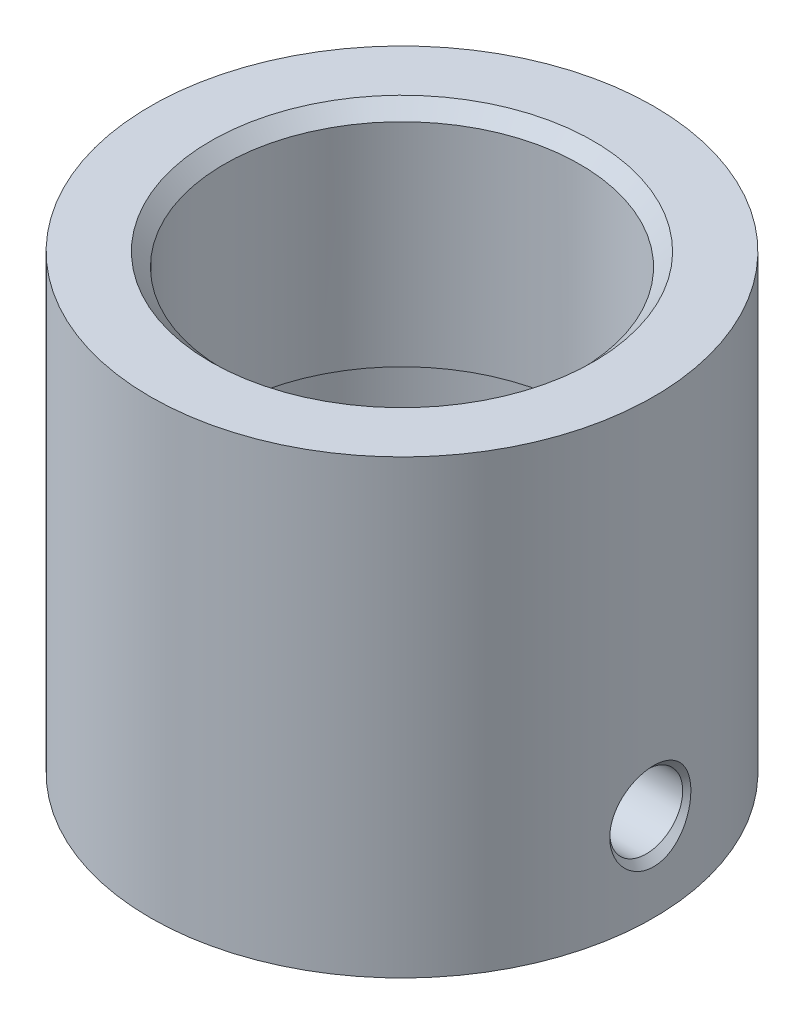
ISO-10303-21;
HEADER;
FILE_DESCRIPTION(('STEP AP214'),'2;1');
FILE_NAME('part.step','',(''),(''),'','','');
FILE_SCHEMA(('AUTOMOTIVE_DESIGN { 1 0 10303 214 1 1 1 1 }'));
ENDSEC;
DATA;
#1=APPLICATION_CONTEXT('core data for automotive mechanical design processes');
#2=APPLICATION_PROTOCOL_DEFINITION('international standard','automotive_design',2000,#1);
#3=PRODUCT_CONTEXT('',#1,'mechanical');
#4=PRODUCT('Part','Part','',(#3));
#5=PRODUCT_RELATED_PRODUCT_CATEGORY('part','',(#4));
#6=PRODUCT_DEFINITION_FORMATION('','',#4);
#7=PRODUCT_DEFINITION_CONTEXT('part definition',#1,'design');
#8=PRODUCT_DEFINITION('design','',#6,#7);
#9=PRODUCT_DEFINITION_SHAPE('','',#8);
#10=(LENGTH_UNIT() NAMED_UNIT(*) SI_UNIT(.MILLI.,.METRE.));
#11=(NAMED_UNIT(*) PLANE_ANGLE_UNIT() SI_UNIT($,.RADIAN.));
#12=(NAMED_UNIT(*) SI_UNIT($,.STERADIAN.) SOLID_ANGLE_UNIT());
#13=UNCERTAINTY_MEASURE_WITH_UNIT(LENGTH_MEASURE(1.E-05),#10,'distance_accuracy_value','');
#14=(GEOMETRIC_REPRESENTATION_CONTEXT(3) GLOBAL_UNCERTAINTY_ASSIGNED_CONTEXT((#13)) GLOBAL_UNIT_ASSIGNED_CONTEXT((#10,
#11,#12)) REPRESENTATION_CONTEXT('',''));
#15=CARTESIAN_POINT('',(0.,0.,0.));
#16=DIRECTION('',(0.,0.,1.));
#17=DIRECTION('',(1.,0.,0.));
#18=AXIS2_PLACEMENT_3D('',#15,#16,#17);
#19=CARTESIAN_POINT('',(0.,26.,0.));
#20=DIRECTION('',(0.,-1.,0.));
#21=DIRECTION('',(0.,0.,-1.));
#22=AXIS2_PLACEMENT_3D('',#19,#20,#21);
#23=CYLINDRICAL_SURFACE('',#22,14.5);
#24=CARTESIAN_POINT('',(14.3998207057451,3.35313342061165,-1.70151808104775));
#25=CARTESIAN_POINT('',(14.4090736667693,3.26254983339858,-1.62320654346101));
#26=CARTESIAN_POINT('',(14.4184592553395,3.17767824931504,-1.53830086542701));
#27=CARTESIAN_POINT('',(14.436684755225,3.02156744104962,-1.35663680703584));
#28=CARTESIAN_POINT('',(14.4455245045379,2.95033225103381,-1.25987493300558));
#29=CARTESIAN_POINT('',(14.4628495980231,2.8158281735512,-1.04361368095848));
#30=CARTESIAN_POINT('',(14.4711540215218,2.75465303008965,-0.922783200290199));
#31=CARTESIAN_POINT('',(14.4849695415903,2.65517980582286,-0.671866678579916));
#32=CARTESIAN_POINT('',(14.4904811598407,2.61687745226895,-0.541782371282166));
#33=CARTESIAN_POINT('',(14.4976882435676,2.56703193052261,-0.286547503062587));
#34=CARTESIAN_POINT('',(14.4996372420317,2.55370905265772,-0.161750512870036));
#35=CARTESIAN_POINT('',(14.500269596164,2.54895642325261,0.088242777111606));
#36=CARTESIAN_POINT('',(14.4989540646005,2.55751921165595,0.213438926312048));
#37=CARTESIAN_POINT('',(14.4933340720818,2.59531931466773,0.455329964313461));
#38=CARTESIAN_POINT('',(14.4891535885481,2.6236999645229,0.572163386728937));
#39=CARTESIAN_POINT('',(14.4783868198641,2.69901516354803,0.799551850744931));
#40=CARTESIAN_POINT('',(14.4718003152172,2.74595140554085,0.910106318464994));
#41=CARTESIAN_POINT('',(14.4566935084134,2.85809502087953,1.12514649130659));
#42=CARTESIAN_POINT('',(14.4481261698863,2.9237577639068,1.22939059422197));
#43=CARTESIAN_POINT('',(14.430022478645,3.0705115127926,1.42626952105182));
#44=CARTESIAN_POINT('',(14.420485849993,3.15160691778844,1.51890102223211));
#45=CARTESIAN_POINT('',(14.4006428715651,3.33316066613405,1.69708718715478));
#46=CARTESIAN_POINT('',(14.3903307095226,3.4345948883259,1.78164639225084));
#47=CARTESIAN_POINT('',(14.3706541116705,3.64945255366651,1.93396286160925));
#48=CARTESIAN_POINT('',(14.3612899963026,3.76288002425182,2.0017144560099));
#49=CARTESIAN_POINT('',(14.3437723951487,4.00766719109626,2.1237450065666));
#50=CARTESIAN_POINT('',(14.3357627863256,4.13973391467967,2.17662873792498));
#51=CARTESIAN_POINT('',(14.322733071464,4.41072373837199,2.26078212649499));
#52=CARTESIAN_POINT('',(14.3177136926852,4.54964849754752,2.29204652592484));
#53=CARTESIAN_POINT('',(14.3110414082137,4.83730593086805,2.33335980380727));
#54=CARTESIAN_POINT('',(14.309555564596,4.98619455158544,2.34235664886581));
#55=CARTESIAN_POINT('',(14.3106078927464,5.28343948987046,2.33591693159675));
#56=CARTESIAN_POINT('',(14.3131465974459,5.43179573433331,2.32047713336471));
#57=CARTESIAN_POINT('',(14.3220192273299,5.72581720507537,2.26507389634563));
#58=CARTESIAN_POINT('',(14.3284034477543,5.87141992031878,2.22478529147919));
#59=CARTESIAN_POINT('',(14.3442568796177,6.1535705463764,2.12016002004971));
#60=CARTESIAN_POINT('',(14.3537262256371,6.29011806186889,2.05582230439036));
#61=CARTESIAN_POINT('',(14.3744354804173,6.54775537183557,1.90558238032398));
#62=CARTESIAN_POINT('',(14.385644886208,6.66905619311687,1.82003882337264));
#63=CARTESIAN_POINT('',(14.4085591739448,6.89446919326739,1.6287018984757));
#64=CARTESIAN_POINT('',(14.4202639201254,6.99858604416773,1.52291405155778));
#65=CARTESIAN_POINT('',(14.4420230386453,7.18034140462346,1.2999271944139));
#66=CARTESIAN_POINT('',(14.4521324334146,7.25910745516533,1.18365483802184));
#67=CARTESIAN_POINT('',(14.4701166872056,7.39401526485013,0.938491693490502));
#68=CARTESIAN_POINT('',(14.4779930201835,7.45017195787284,0.809609304671009));
#69=CARTESIAN_POINT('',(14.4899122693188,7.53343841039343,0.554422898235619));
#70=CARTESIAN_POINT('',(14.4942186791082,7.56256892304655,0.428789623826561));
#71=CARTESIAN_POINT('',(14.4995098582716,7.59803385524168,0.174290413594696));
#72=CARTESIAN_POINT('',(14.5004960622795,7.60437812061523,0.0454258982202043));
#73=CARTESIAN_POINT('',(14.4990739575387,7.59429295655022,-0.203526197326038));
#74=CARTESIAN_POINT('',(14.4968676782199,7.57921993599244,-0.323672540549693));
#75=CARTESIAN_POINT('',(14.4896748378335,7.5293794516358,-0.559703351680214));
#76=CARTESIAN_POINT('',(14.4846883297811,7.49461236337576,-0.675587900808769));
#77=CARTESIAN_POINT('',(14.4724494192999,7.40662361457527,-0.900538292064099));
#78=CARTESIAN_POINT('',(14.4651873300495,7.35332295084456,-1.00957254558632));
#79=CARTESIAN_POINT('',(14.4491501390911,7.2302660135206,-1.21777761396307));
#80=CARTESIAN_POINT('',(14.4403746874816,7.16050593300464,-1.3169461394038));
#81=CARTESIAN_POINT('',(14.421589411466,7.00202787811996,-1.50919309343842));
#82=CARTESIAN_POINT('',(14.4115368778965,6.91240876404083,-1.6015235216947));
#83=CARTESIAN_POINT('',(14.3916774555139,6.71990102644793,-1.77113775355985));
#84=CARTESIAN_POINT('',(14.3818706518551,6.61700787691817,-1.84841640233878));
#85=CARTESIAN_POINT('',(14.3627006708727,6.39215857925481,-1.99211120124944));
#86=CARTESIAN_POINT('',(14.3534334424584,6.26933903797698,-2.05719041284637));
#87=CARTESIAN_POINT('',(14.3372322319333,6.01485556161351,-2.16722708203806));
#88=CARTESIAN_POINT('',(14.3302988730952,5.88318927519926,-2.21217916562803));
#89=CARTESIAN_POINT('',(14.3191589142442,5.60657438691383,-2.28321566857917));
#90=CARTESIAN_POINT('',(14.3151334019229,5.46129811882523,-2.30805719179887));
#91=CARTESIAN_POINT('',(14.3109383154676,5.16856388028875,-2.33392708654996));
#92=CARTESIAN_POINT('',(14.3107697365574,5.02110535656425,-2.33494931187043));
#93=CARTESIAN_POINT('',(14.3143516505899,4.72449134401652,-2.31289166994378));
#94=CARTESIAN_POINT('',(14.318195908769,4.57537953176971,-2.28923515955929));
#95=CARTESIAN_POINT('',(14.329501449434,4.28335477666343,-2.2173640140618));
#96=CARTESIAN_POINT('',(14.3369614898404,4.14043972347109,-2.16915781187427));
#97=CARTESIAN_POINT('',(14.3533246470289,3.88502011947513,-2.0578467929428));
#98=CARTESIAN_POINT('',(14.3618634624169,3.77110538141007,-1.99790145844625));
#99=CARTESIAN_POINT('',(14.3801582395916,3.55365967501007,-1.86165661104716));
#100=CARTESIAN_POINT('',(14.3899134489491,3.45012235828005,-1.7853671873969));
#101=CARTESIAN_POINT('',(14.3998207057451,3.35313342061165,-1.70151808104775));
#102=B_SPLINE_CURVE_WITH_KNOTS('',3,(#24,#25,#26,#27,#28,#29,#30,#31,#32,#33,#34,#35,#36,#37,
#38,#39,#40,#41,#42,#43,#44,#45,#46,#47,#48,#49,#50,#51,#52,#53,#54,#55,#56,#57,#58,#59,#60,#61,
#62,#63,#64,#65,#66,#67,#68,#69,#70,#71,#72,#73,#74,#75,#76,#77,#78,#79,#80,#81,#82,#83,#84,#85,
#86,#87,#88,#89,#90,#91,#92,#93,#94,#95,#96,#97,#98,#99,#100,#101),.UNSPECIFIED.,.T.,.F.,(4,2,2,
2,2,2,2,2,2,2,2,2,2,2,2,2,2,2,2,2,2,2,2,2,2,2,2,2,2,2,2,2,2,2,2,2,2,2,4),(0.,0.359952818555661,
0.720011960885404,1.124867306396,1.52964699927667,1.90429486746711,2.27881504836485,
2.6380742544735,2.99736624329188,3.36627391481056,3.735286902769,4.13097216698077,
4.52679073028781,4.95235718997434,5.37802711027645,5.82345380205119,6.26893948223879,
6.72038213696941,7.17184448731842,7.61613794090942,8.06031039891669,8.48045917134721,
8.90032997100636,9.28542125631568,9.67034612543834,10.0319511702033,10.3935493198889,
10.7567081449672,11.1199510480667,11.5055011815147,11.8911831242436,12.3072754896963,
12.7234788869304,13.1637763212161,13.6041873663628,14.055124585974,14.5059070110733,
14.8915502047763,15.276956022282),.UNSPECIFIED.);
#103=CARTESIAN_POINT('',(14.3998207057451,3.35313342061165,-1.70151808104775));
#104=VERTEX_POINT('',#103);
#105=EDGE_CURVE('E10',#104,#104,#102,.T.);
#106=ORIENTED_EDGE('',*,*,#105,.T.);
#107=EDGE_LOOP('',(#106));
#108=FACE_BOUND('',#107,.T.);
#109=CARTESIAN_POINT('',(0.,26.,0.));
#110=DIRECTION('',(0.,1.,0.));
#111=DIRECTION('',(0.,0.,1.));
#112=AXIS2_PLACEMENT_3D('',#109,#110,#111);
#113=CIRCLE('',#112,14.5);
#114=CARTESIAN_POINT('',(0.,26.,14.5));
#115=VERTEX_POINT('',#114);
#116=EDGE_CURVE('E45',#115,#115,#113,.T.);
#117=ORIENTED_EDGE('',*,*,#116,.F.);
#118=EDGE_LOOP('',(#117));
#119=FACE_BOUND('',#118,.T.);
#120=CARTESIAN_POINT('',(0.,0.,0.));
#121=DIRECTION('',(0.,1.,0.));
#122=DIRECTION('',(0.,0.,1.));
#123=AXIS2_PLACEMENT_3D('',#120,#121,#122);
#124=CIRCLE('',#123,14.5);
#125=CARTESIAN_POINT('',(0.,0.,14.5));
#126=VERTEX_POINT('',#125);
#127=EDGE_CURVE('E49',#126,#126,#124,.T.);
#128=ORIENTED_EDGE('',*,*,#127,.T.);
#129=EDGE_LOOP('',(#128));
#130=FACE_BOUND('',#129,.T.);
#131=ADVANCED_FACE('F34',(#108,#119,#130),#23,.T.);
#132=CARTESIAN_POINT('',(0.,26.,0.));
#133=DIRECTION('',(0.,1.,0.));
#134=DIRECTION('',(0.,0.,1.));
#135=AXIS2_PLACEMENT_3D('',#132,#133,#134);
#136=PLANE('',#135);
#137=CARTESIAN_POINT('',(0.,26.,0.));
#138=DIRECTION('',(0.,1.,0.));
#139=DIRECTION('',(0.,0.,1.));
#140=AXIS2_PLACEMENT_3D('',#137,#138,#139);
#141=CIRCLE('',#140,11.025);
#142=CARTESIAN_POINT('',(0.,26.,11.025));
#143=VERTEX_POINT('',#142);
#144=EDGE_CURVE('E67',#143,#143,#141,.T.);
#145=ORIENTED_EDGE('',*,*,#144,.F.);
#146=EDGE_LOOP('',(#145));
#147=FACE_BOUND('',#146,.T.);
#148=ORIENTED_EDGE('',*,*,#116,.T.);
#149=EDGE_LOOP('',(#148));
#150=FACE_BOUND('',#149,.T.);
#151=ADVANCED_FACE('F98',(#147,#150),#136,.T.);
#152=CARTESIAN_POINT('',(0.,0.,0.));
#153=DIRECTION('',(0.,1.,0.));
#154=DIRECTION('',(0.,0.,1.));
#155=AXIS2_PLACEMENT_3D('',#152,#153,#154);
#156=PLANE('',#155);
#157=CARTESIAN_POINT('',(0.,0.,0.));
#158=DIRECTION('',(0.,-1.,0.));
#159=DIRECTION('',(0.,0.,-1.));
#160=AXIS2_PLACEMENT_3D('',#157,#158,#159);
#161=CIRCLE('',#160,10.5);
#162=CARTESIAN_POINT('',(0.,0.,-10.5));
#163=VERTEX_POINT('',#162);
#164=EDGE_CURVE('E56',#163,#163,#161,.T.);
#165=ORIENTED_EDGE('',*,*,#164,.F.);
#166=EDGE_LOOP('',(#165));
#167=FACE_BOUND('',#166,.T.);
#168=ORIENTED_EDGE('',*,*,#127,.F.);
#169=EDGE_LOOP('',(#168));
#170=FACE_BOUND('',#169,.T.);
#171=ADVANCED_FACE('F102',(#167,#170),#156,.F.);
#172=CARTESIAN_POINT('',(0.,13.,0.));
#173=DIRECTION('',(0.,-1.,0.));
#174=DIRECTION('',(0.,0.,-1.));
#175=AXIS2_PLACEMENT_3D('',#172,#173,#174);
#176=CYLINDRICAL_SURFACE('',#175,10.5);
#177=CARTESIAN_POINT('',(10.2884616297896,5.07594316398738,-2.09703535791539));
#178=CARTESIAN_POINT('',(10.2884639484167,5.19262835251881,-2.09703104358514));
#179=CARTESIAN_POINT('',(10.2904655716909,5.3093678729874,-2.08727644066124));
#180=CARTESIAN_POINT('',(10.298243795859,5.53954442478796,-2.04854833259153));
#181=CARTESIAN_POINT('',(10.3040234172835,5.65297873772294,-2.01955944925293));
#182=CARTESIAN_POINT('',(10.3186767584052,5.87318150103123,-1.94329778822472));
#183=CARTESIAN_POINT('',(10.3275473997462,5.97995645920582,-1.8960431963126));
#184=CARTESIAN_POINT('',(10.3473784820406,6.18406033785099,-1.78464149353863));
#185=CARTESIAN_POINT('',(10.3583388063471,6.28138978511698,-1.72049532549625));
#186=CARTESIAN_POINT('',(10.3812859131232,6.46522127208049,-1.57616464686192));
#187=CARTESIAN_POINT('',(10.3932839529556,6.55157029854372,-1.49578700470832));
#188=CARTESIAN_POINT('',(10.4168532105564,6.70965398450324,-1.32169258527588));
#189=CARTESIAN_POINT('',(10.4284243983588,6.78138761956349,-1.22797487373363));
#190=CARTESIAN_POINT('',(10.449955631969,6.90879800100715,-1.02884762480045));
#191=CARTESIAN_POINT('',(10.4599007556973,6.96432934300232,-0.923343299298098));
#192=CARTESIAN_POINT('',(10.4769298523128,7.05682053178847,-0.704269706789683));
#193=CARTESIAN_POINT('',(10.4840140930083,7.09378211697946,-0.590701195845444));
#194=CARTESIAN_POINT('',(10.4944409976418,7.14760827058859,-0.36031115455876));
#195=CARTESIAN_POINT('',(10.4978317300478,7.1647312168865,-0.24355220110196));
#196=CARTESIAN_POINT('',(10.5006523088919,7.17920016284784,-0.00877311994239943));
#197=CARTESIAN_POINT('',(10.5000825370065,7.17654806824361,0.109246885137482));
#198=CARTESIAN_POINT('',(10.4950811834726,7.15173818553472,0.341422484498701));
#199=CARTESIAN_POINT('',(10.4907047126304,7.1298587119349,0.455609176578375));
#200=CARTESIAN_POINT('',(10.4786405934979,7.06765659582371,0.678655975227076));
#201=CARTESIAN_POINT('',(10.4709528127251,7.02733321538445,0.787515868481663));
#202=CARTESIAN_POINT('',(10.4530361776433,6.92913007967812,0.997613067189331));
#203=CARTESIAN_POINT('',(10.4427916149653,6.87114128666712,1.09879801227048));
#204=CARTESIAN_POINT('',(10.4208885346126,6.73933410179052,1.29010353923294));
#205=CARTESIAN_POINT('',(10.4092298543063,6.6655138884693,1.38022284609938));
#206=CARTESIAN_POINT('',(10.3855444688319,6.50261255755959,1.54849077410074));
#207=CARTESIAN_POINT('',(10.3735148909471,6.41328787185524,1.62640337047766));
#208=CARTESIAN_POINT('',(10.3506344893998,6.2227186348408,1.76618155391772));
#209=CARTESIAN_POINT('',(10.3397836880343,6.12147385813267,1.82804683746995));
#210=CARTESIAN_POINT('',(10.3204821067214,5.90959941716159,1.93405594757192));
#211=CARTESIAN_POINT('',(10.3120365127732,5.79895013194409,1.97816156496503));
#212=CARTESIAN_POINT('',(10.2985765404041,5.571603384167,2.0470874462779));
#213=CARTESIAN_POINT('',(10.2935617148,5.45490671198731,2.07191022367443));
#214=CARTESIAN_POINT('',(10.2876200049218,5.22091696218939,2.10121318654119));
#215=CARTESIAN_POINT('',(10.2866246392328,5.10366825793567,2.10603419092609));
#216=CARTESIAN_POINT('',(10.2886506092224,4.87004189526805,2.09611389008586));
#217=CARTESIAN_POINT('',(10.2916717171335,4.75366418783777,2.08137369414268));
#218=CARTESIAN_POINT('',(10.3013264671752,4.52622901937369,2.03304315765313));
#219=CARTESIAN_POINT('',(10.3079251912965,4.41513124361228,1.99963492456509));
#220=CARTESIAN_POINT('',(10.3239618454454,4.20011027802703,1.91511121257286));
#221=CARTESIAN_POINT('',(10.3334000093507,4.09618768007237,1.86399427499322));
#222=CARTESIAN_POINT('',(10.3542071919646,3.89697563309205,1.74473244552073));
#223=CARTESIAN_POINT('',(10.3655997745238,3.80181636675565,1.67637429068693));
#224=CARTESIAN_POINT('',(10.388969228735,3.62419570878546,1.52485445643466));
#225=CARTESIAN_POINT('',(10.4009461604305,3.54173562566395,1.44169125341838));
#226=CARTESIAN_POINT('',(10.4243592126765,3.39056178969767,1.26139171619359));
#227=CARTESIAN_POINT('',(10.4357842088066,3.32207848922239,1.16406047779282));
#228=CARTESIAN_POINT('',(10.4566137464933,3.20243681283826,0.959075806714799));
#229=CARTESIAN_POINT('',(10.4660183728937,3.15127770936334,0.851422807765282));
#230=CARTESIAN_POINT('',(10.4817022260336,3.06807253331945,0.62945606933801));
#231=CARTESIAN_POINT('',(10.487999141638,3.03591807571225,0.515184263690082));
#232=CARTESIAN_POINT('',(10.4968369209789,2.99129154389331,0.282722641262218));
#233=CARTESIAN_POINT('',(10.4993782371009,2.97881709908846,0.164533298128079));
#234=CARTESIAN_POINT('',(10.5004100164651,2.97399650396531,-0.0702072757909427));
#235=CARTESIAN_POINT('',(10.4989701997773,2.98130387502931,-0.186751223827601));
#236=CARTESIAN_POINT('',(10.4923514890647,3.01507446013782,-0.416915700900927));
#237=CARTESIAN_POINT('',(10.4871726420547,3.04153743331846,-0.530536266677805));
#238=CARTESIAN_POINT('',(10.4736624280394,3.11271404737972,-0.751412708941241));
#239=CARTESIAN_POINT('',(10.4653382551473,3.15738605806243,-0.858682468433157));
#240=CARTESIAN_POINT('',(10.4464362744757,3.26366887078271,-1.0642543553604));
#241=CARTESIAN_POINT('',(10.4358582886203,3.32528101138683,-1.16255577332206));
#242=CARTESIAN_POINT('',(10.4133987759751,3.46486387681608,-1.34911349412392));
#243=CARTESIAN_POINT('',(10.4014989728844,3.54308247039331,-1.43718216145338));
#244=CARTESIAN_POINT('',(10.3778468988915,3.7131486681948,-1.59906307722163));
#245=CARTESIAN_POINT('',(10.366094663598,3.80499949589522,-1.67287194426293));
#246=CARTESIAN_POINT('',(10.3439307259088,4.00090972903729,-1.80489302262377));
#247=CARTESIAN_POINT('',(10.3335348266467,4.10508998234201,-1.86292867057478));
#248=CARTESIAN_POINT('',(10.3154553692654,4.32190198783359,-1.96057807717716));
#249=CARTESIAN_POINT('',(10.3077693522557,4.43452596523048,-2.0002085467164));
#250=CARTESIAN_POINT('',(10.2975151055209,4.63549432041742,-2.05223794090167));
#251=CARTESIAN_POINT('',(10.2941411168479,4.72269254496669,-2.0690069070471));
#252=CARTESIAN_POINT('',(10.2896135359362,4.89856446854477,-2.09140706346315));
#253=CARTESIAN_POINT('',(10.2884598671501,4.98723811660077,-2.097038637705));
#254=CARTESIAN_POINT('',(10.2884616297896,5.07594316398738,-2.09703535791539));
#255=B_SPLINE_CURVE_WITH_KNOTS('',3,(#177,#178,#179,#180,#181,#182,#183,#184,#185,#186,#187,
#188,#189,#190,#191,#192,#193,#194,#195,#196,#197,#198,#199,#200,#201,#202,#203,#204,#205,#206,
#207,#208,#209,#210,#211,#212,#213,#214,#215,#216,#217,#218,#219,#220,#221,#222,#223,#224,#225,
#226,#227,#228,#229,#230,#231,#232,#233,#234,#235,#236,#237,#238,#239,#240,#241,#242,#243,#244,
#245,#246,#247,#248,#249,#250,#251,#252,#253,#254),.UNSPECIFIED.,.T.,.F.,(4,2,2,2,2,2,2,2,2,2,2,
2,2,2,2,2,2,2,2,2,2,2,2,2,2,2,2,2,2,2,2,2,2,2,2,2,2,2,4),(0.,0.349730774125798,
0.699741502497022,1.04940464567523,1.39904827620571,1.75312730351717,2.10723114074386,
2.46442140918645,2.82157823317775,3.17402922654469,3.52644625444121,3.87384458230428,
4.22125681054875,4.57085840866837,4.92050025117138,5.27623628201215,5.63197904057712,
5.9884831266283,6.34494073533651,6.69529891389646,7.04563722509685,7.39261617744969,
7.73962371744236,8.09115425526494,8.44272099027438,8.79968463640246,9.15663328923219,
9.51152608515165,9.86637612852418,10.2150513657084,10.5637222187019,10.9116003585845,
11.2595059948284,11.6130241925375,11.9666261166854,12.3240368701717,12.6811224768942,
12.9469998764014,13.2128681093951),.UNSPECIFIED.);
#256=CARTESIAN_POINT('',(10.2884616297896,5.07594316398738,-2.09703535791539));
#257=VERTEX_POINT('',#256);
#258=EDGE_CURVE('E70',#257,#257,#255,.T.);
#259=ORIENTED_EDGE('',*,*,#258,.T.);
#260=EDGE_LOOP('',(#259));
#261=FACE_BOUND('',#260,.T.);
#262=CARTESIAN_POINT('',(0.,13.,0.));
#263=DIRECTION('',(0.,-1.,0.));
#264=DIRECTION('',(0.,0.,-1.));
#265=AXIS2_PLACEMENT_3D('',#262,#263,#264);
#266=CIRCLE('',#265,10.5);
#267=CARTESIAN_POINT('',(0.,13.,-10.5));
#268=VERTEX_POINT('',#267);
#269=EDGE_CURVE('E54',#268,#268,#266,.T.);
#270=ORIENTED_EDGE('',*,*,#269,.F.);
#271=EDGE_LOOP('',(#270));
#272=FACE_BOUND('',#271,.T.);
#273=ORIENTED_EDGE('',*,*,#164,.T.);
#274=EDGE_LOOP('',(#273));
#275=FACE_BOUND('',#274,.T.);
#276=ADVANCED_FACE('F110',(#261,#272,#275),#176,.F.);
#277=CARTESIAN_POINT('',(0.,13.,0.));
#278=DIRECTION('',(0.,-1.,0.));
#279=DIRECTION('',(0.,0.,-1.));
#280=AXIS2_PLACEMENT_3D('',#277,#278,#279);
#281=PLANE('',#280);
#282=CARTESIAN_POINT('',(0.,13.,0.));
#283=DIRECTION('',(0.,-1.,0.));
#284=DIRECTION('',(0.,0.,-1.));
#285=AXIS2_PLACEMENT_3D('',#282,#283,#284);
#286=CIRCLE('',#285,10.25);
#287=CARTESIAN_POINT('',(0.,13.,-10.25));
#288=VERTEX_POINT('',#287);
#289=EDGE_CURVE('E59',#288,#288,#286,.T.);
#290=ORIENTED_EDGE('',*,*,#289,.F.);
#291=EDGE_LOOP('',(#290));
#292=FACE_BOUND('',#291,.T.);
#293=ORIENTED_EDGE('',*,*,#269,.T.);
#294=EDGE_LOOP('',(#293));
#295=FACE_BOUND('',#294,.T.);
#296=ADVANCED_FACE('F115',(#292,#295),#281,.T.);
#297=CARTESIAN_POINT('',(0.,26.,0.));
#298=DIRECTION('',(0.,1.,0.));
#299=DIRECTION('',(0.,0.,1.));
#300=AXIS2_PLACEMENT_3D('',#297,#298,#299);
#301=CYLINDRICAL_SURFACE('',#300,10.25);
#302=CARTESIAN_POINT('',(0.,25.225,0.));
#303=DIRECTION('',(0.,1.,0.));
#304=DIRECTION('',(0.,0.,1.));
#305=AXIS2_PLACEMENT_3D('',#302,#303,#304);
#306=CIRCLE('',#305,10.25);
#307=CARTESIAN_POINT('',(0.,25.225,10.25));
#308=VERTEX_POINT('',#307);
#309=EDGE_CURVE('E64',#308,#308,#306,.T.);
#310=ORIENTED_EDGE('',*,*,#309,.T.);
#311=EDGE_LOOP('',(#310));
#312=FACE_BOUND('',#311,.T.);
#313=ORIENTED_EDGE('',*,*,#289,.T.);
#314=EDGE_LOOP('',(#313));
#315=FACE_BOUND('',#314,.T.);
#316=ADVANCED_FACE('F93',(#312,#315),#301,.F.);
#317=CARTESIAN_POINT('',(0.,26.,0.));
#318=DIRECTION('',(0.,1.,0.));
#319=DIRECTION('',(0.,0.,1.));
#320=AXIS2_PLACEMENT_3D('',#317,#318,#319);
#321=CONICAL_SURFACE('',#320,11.025,0.785398163397444);
#322=ORIENTED_EDGE('',*,*,#309,.F.);
#323=EDGE_LOOP('',(#322));
#324=FACE_BOUND('',#323,.T.);
#325=ORIENTED_EDGE('',*,*,#144,.T.);
#326=EDGE_LOOP('',(#325));
#327=FACE_BOUND('',#326,.T.);
#328=ADVANCED_FACE('F88',(#324,#327),#321,.F.);
#329=CARTESIAN_POINT('',(14.4999993979852,5.07594316398738,0.00417832852180056));
#330=DIRECTION('',(0.999999958481737,0.,0.000288160587710413));
#331=DIRECTION('',(0.000288160587710413,0.,-0.999999958481737));
#332=AXIS2_PLACEMENT_3D('',#329,#330,#331);
#333=CONICAL_SURFACE('',#332,2.525,0.785398163397444);
#334=CARTESIAN_POINT('',(14.0749994156304,5.07594316398738,0.00405586027202363));
#335=DIRECTION('',(0.999999958481737,0.,0.000288160587710413));
#336=DIRECTION('',(0.000288160587710413,0.,-0.999999958481737));
#337=AXIS2_PLACEMENT_3D('',#334,#335,#336);
#338=CIRCLE('',#337,2.1);
#339=CARTESIAN_POINT('',(14.0756045528646,5.07594316398738,-2.09594405253962));
#340=VERTEX_POINT('',#339);
#341=EDGE_CURVE('E78',#340,#340,#338,.T.);
#342=ORIENTED_EDGE('',*,*,#341,.F.);
#343=EDGE_LOOP('',(#342));
#344=FACE_BOUND('',#343,.T.);
#345=ORIENTED_EDGE('',*,*,#105,.F.);
#346=EDGE_LOOP('',(#345));
#347=FACE_BOUND('',#346,.T.);
#348=ADVANCED_FACE('F84',(#344,#347),#333,.F.);
#349=CARTESIAN_POINT('',(14.4999993979852,5.07594316398738,0.00417832852180056));
#350=DIRECTION('',(0.999999958481737,0.,0.000288160587710413));
#351=DIRECTION('',(0.000288160587710413,0.,-0.999999958481737));
#352=AXIS2_PLACEMENT_3D('',#349,#350,#351);
#353=CYLINDRICAL_SURFACE('',#352,2.1);
#354=ORIENTED_EDGE('',*,*,#258,.F.);
#355=EDGE_LOOP('',(#354));
#356=FACE_BOUND('',#355,.T.);
#357=ORIENTED_EDGE('',*,*,#341,.T.);
#358=EDGE_LOOP('',(#357));
#359=FACE_BOUND('',#358,.T.);
#360=ADVANCED_FACE('F81',(#356,#359),#353,.F.);
#361=CLOSED_SHELL('',(#131,#151,#171,#276,#296,#316,#328,#348,#360));
#362=MANIFOLD_SOLID_BREP('B2',#361);
#363=ADVANCED_BREP_SHAPE_REPRESENTATION('',(#18,#362),#14);
#364=SHAPE_DEFINITION_REPRESENTATION(#9,#363);
ENDSEC;
END-ISO-10303-21;
